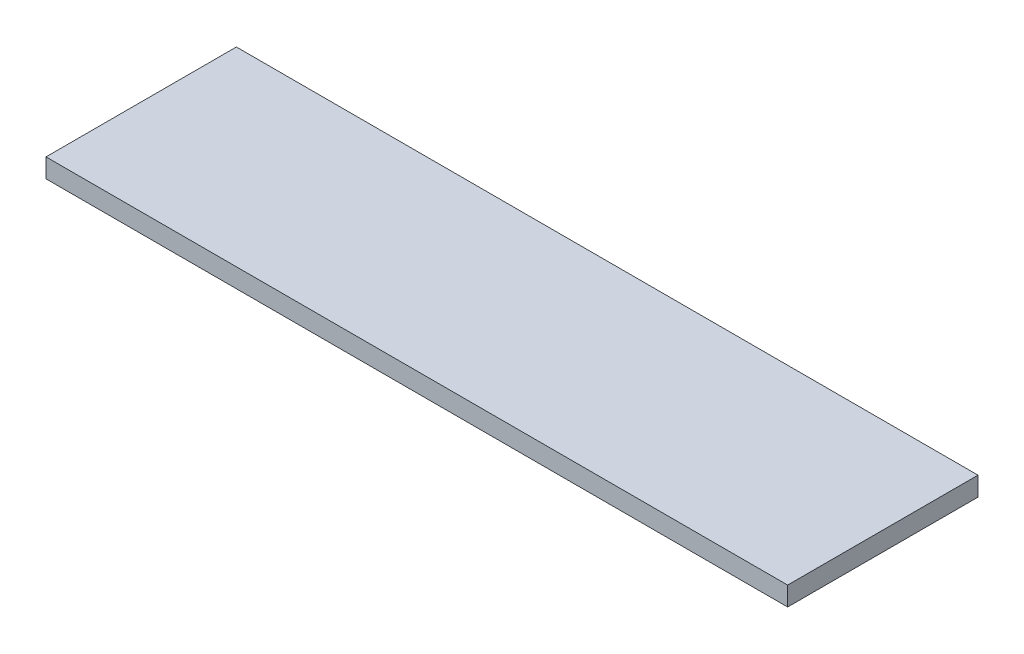
ISO-10303-21;
HEADER;
FILE_DESCRIPTION(('STEP AP214'),'2;1');
FILE_NAME('part.step','',(''),(''),'','','');
FILE_SCHEMA(('AUTOMOTIVE_DESIGN { 1 0 10303 214 1 1 1 1 }'));
ENDSEC;
DATA;
#1=APPLICATION_CONTEXT('core data for automotive mechanical design processes');
#2=APPLICATION_PROTOCOL_DEFINITION('international standard','automotive_design',2000,#1);
#3=PRODUCT_CONTEXT('',#1,'mechanical');
#4=PRODUCT('Part','Part','',(#3));
#5=PRODUCT_RELATED_PRODUCT_CATEGORY('part','',(#4));
#6=PRODUCT_DEFINITION_FORMATION('','',#4);
#7=PRODUCT_DEFINITION_CONTEXT('part definition',#1,'design');
#8=PRODUCT_DEFINITION('design','',#6,#7);
#9=PRODUCT_DEFINITION_SHAPE('','',#8);
#10=(LENGTH_UNIT() NAMED_UNIT(*) SI_UNIT(.MILLI.,.METRE.));
#11=(NAMED_UNIT(*) PLANE_ANGLE_UNIT() SI_UNIT($,.RADIAN.));
#12=(NAMED_UNIT(*) SI_UNIT($,.STERADIAN.) SOLID_ANGLE_UNIT());
#13=UNCERTAINTY_MEASURE_WITH_UNIT(LENGTH_MEASURE(1.E-05),#10,'distance_accuracy_value','');
#14=(GEOMETRIC_REPRESENTATION_CONTEXT(3) GLOBAL_UNCERTAINTY_ASSIGNED_CONTEXT((#13)) GLOBAL_UNIT_ASSIGNED_CONTEXT((#10,
#11,#12)) REPRESENTATION_CONTEXT('',''));
#15=CARTESIAN_POINT('',(0.,0.,0.));
#16=DIRECTION('',(0.,0.,1.));
#17=DIRECTION('',(1.,0.,0.));
#18=AXIS2_PLACEMENT_3D('',#15,#16,#17);
#19=CARTESIAN_POINT('',(-47.625,1.5875,7.9375));
#20=DIRECTION('',(0.,0.,-1.));
#21=DIRECTION('',(-1.,0.,0.));
#22=AXIS2_PLACEMENT_3D('',#19,#20,#21);
#23=PLANE('',#22);
#24=DIRECTION('',(0.,1.,0.));
#25=VECTOR('',#24,1.);
#26=CARTESIAN_POINT('',(30.9245,-0.000999999999999916,7.9375));
#27=LINE('',#26,#25);
#28=CARTESIAN_POINT('',(30.9245,0.,7.9375));
#29=VERTEX_POINT('',#28);
#30=CARTESIAN_POINT('',(30.9245,1.5875,7.9375));
#31=VERTEX_POINT('',#30);
#32=EDGE_CURVE('E55',#29,#31,#27,.T.);
#33=ORIENTED_EDGE('',*,*,#32,.T.);
#34=DIRECTION('',(1.,0.,0.));
#35=VECTOR('',#34,1.);
#36=CARTESIAN_POINT('',(-47.625,1.5875,7.9375));
#37=LINE('',#36,#35);
#38=CARTESIAN_POINT('',(-30.9245,1.5875,7.9375));
#39=VERTEX_POINT('',#38);
#40=EDGE_CURVE('E47',#39,#31,#37,.T.);
#41=ORIENTED_EDGE('',*,*,#40,.F.);
#42=DIRECTION('',(0.,1.,0.));
#43=VECTOR('',#42,1.);
#44=CARTESIAN_POINT('',(-30.9245,-0.000999999999999916,7.9375));
#45=LINE('',#44,#43);
#46=CARTESIAN_POINT('',(-30.9245,0.,7.9375));
#47=VERTEX_POINT('',#46);
#48=EDGE_CURVE('E89',#47,#39,#45,.T.);
#49=ORIENTED_EDGE('',*,*,#48,.F.);
#50=DIRECTION('',(1.,0.,0.));
#51=VECTOR('',#50,1.);
#52=CARTESIAN_POINT('',(-47.625,0.,7.9375));
#53=LINE('',#52,#51);
#54=EDGE_CURVE('E96',#47,#29,#53,.T.);
#55=ORIENTED_EDGE('',*,*,#54,.T.);
#56=EDGE_LOOP('',(#33,#41,#49,#55));
#57=FACE_BOUND('',#56,.T.);
#58=ADVANCED_FACE('F38',(#57),#23,.F.);
#59=CARTESIAN_POINT('',(-47.625,1.5875,-7.9375));
#60=DIRECTION('',(0.,0.,1.));
#61=DIRECTION('',(1.,0.,0.));
#62=AXIS2_PLACEMENT_3D('',#59,#60,#61);
#63=PLANE('',#62);
#64=DIRECTION('',(0.,1.,0.));
#65=VECTOR('',#64,1.);
#66=CARTESIAN_POINT('',(30.9245,-0.000999999999999916,-7.9375));
#67=LINE('',#66,#65);
#68=CARTESIAN_POINT('',(30.9245,0.,-7.9375));
#69=VERTEX_POINT('',#68);
#70=CARTESIAN_POINT('',(30.9245,1.5875,-7.9375));
#71=VERTEX_POINT('',#70);
#72=EDGE_CURVE('E81',#69,#71,#67,.T.);
#73=ORIENTED_EDGE('',*,*,#72,.F.);
#74=DIRECTION('',(-1.,0.,0.));
#75=VECTOR('',#74,1.);
#76=CARTESIAN_POINT('',(-47.625,0.,-7.9375));
#77=LINE('',#76,#75);
#78=CARTESIAN_POINT('',(-30.9245,0.,-7.9375));
#79=VERTEX_POINT('',#78);
#80=EDGE_CURVE('E41',#69,#79,#77,.T.);
#81=ORIENTED_EDGE('',*,*,#80,.T.);
#82=DIRECTION('',(0.,1.,0.));
#83=VECTOR('',#82,1.);
#84=CARTESIAN_POINT('',(-30.9245,-0.000999999999999916,-7.9375));
#85=LINE('',#84,#83);
#86=CARTESIAN_POINT('',(-30.9245,1.5875,-7.9375));
#87=VERTEX_POINT('',#86);
#88=EDGE_CURVE('E63',#79,#87,#85,.T.);
#89=ORIENTED_EDGE('',*,*,#88,.T.);
#90=DIRECTION('',(-1.,0.,0.));
#91=VECTOR('',#90,1.);
#92=CARTESIAN_POINT('',(-47.625,1.5875,-7.9375));
#93=LINE('',#92,#91);
#94=EDGE_CURVE('E11',#71,#87,#93,.T.);
#95=ORIENTED_EDGE('',*,*,#94,.F.);
#96=EDGE_LOOP('',(#73,#81,#89,#95));
#97=FACE_BOUND('',#96,.T.);
#98=ADVANCED_FACE('F94',(#97),#63,.F.);
#99=CARTESIAN_POINT('',(-47.625,1.5875,0.));
#100=DIRECTION('',(0.,1.,0.));
#101=DIRECTION('',(0.,0.,1.));
#102=AXIS2_PLACEMENT_3D('',#99,#100,#101);
#103=PLANE('',#102);
#104=ORIENTED_EDGE('',*,*,#40,.T.);
#105=DIRECTION('',(0.,0.,-1.));
#106=VECTOR('',#105,1.);
#107=CARTESIAN_POINT('',(30.9245,1.5875,-7.9375));
#108=LINE('',#107,#106);
#109=EDGE_CURVE('E88',#31,#71,#108,.T.);
#110=ORIENTED_EDGE('',*,*,#109,.T.);
#111=ORIENTED_EDGE('',*,*,#94,.T.);
#112=DIRECTION('',(0.,0.,1.));
#113=VECTOR('',#112,1.);
#114=CARTESIAN_POINT('',(-30.9245,1.5875,-7.9375));
#115=LINE('',#114,#113);
#116=EDGE_CURVE('E112',#87,#39,#115,.T.);
#117=ORIENTED_EDGE('',*,*,#116,.T.);
#118=EDGE_LOOP('',(#104,#110,#111,#117));
#119=FACE_BOUND('',#118,.T.);
#120=ADVANCED_FACE('F122',(#119),#103,.T.);
#121=CARTESIAN_POINT('',(-47.625,0.,0.));
#122=DIRECTION('',(0.,1.,0.));
#123=DIRECTION('',(0.,0.,1.));
#124=AXIS2_PLACEMENT_3D('',#121,#122,#123);
#125=PLANE('',#124);
#126=DIRECTION('',(0.,0.,1.));
#127=VECTOR('',#126,1.);
#128=CARTESIAN_POINT('',(30.9245,0.,-7.9375));
#129=LINE('',#128,#127);
#130=EDGE_CURVE('E78',#69,#29,#129,.T.);
#131=ORIENTED_EDGE('',*,*,#130,.T.);
#132=ORIENTED_EDGE('',*,*,#54,.F.);
#133=DIRECTION('',(0.,0.,-1.));
#134=VECTOR('',#133,1.);
#135=CARTESIAN_POINT('',(-30.9245,0.,-7.9375));
#136=LINE('',#135,#134);
#137=EDGE_CURVE('E99',#47,#79,#136,.T.);
#138=ORIENTED_EDGE('',*,*,#137,.T.);
#139=ORIENTED_EDGE('',*,*,#80,.F.);
#140=EDGE_LOOP('',(#131,#132,#138,#139));
#141=FACE_BOUND('',#140,.T.);
#142=ADVANCED_FACE('F98',(#141),#125,.F.);
#143=CARTESIAN_POINT('',(-30.9245,-0.000999999999999916,-7.9375));
#144=DIRECTION('',(-1.,0.,0.));
#145=DIRECTION('',(0.,0.,1.));
#146=AXIS2_PLACEMENT_3D('',#143,#144,#145);
#147=PLANE('',#146);
#148=ORIENTED_EDGE('',*,*,#48,.T.);
#149=ORIENTED_EDGE('',*,*,#116,.F.);
#150=ORIENTED_EDGE('',*,*,#88,.F.);
#151=ORIENTED_EDGE('',*,*,#137,.F.);
#152=EDGE_LOOP('',(#148,#149,#150,#151));
#153=FACE_BOUND('',#152,.T.);
#154=ADVANCED_FACE('F124',(#153),#147,.T.);
#155=CARTESIAN_POINT('',(30.9245,-0.000999999999999916,-7.9375));
#156=DIRECTION('',(1.,0.,0.));
#157=DIRECTION('',(0.,0.,-1.));
#158=AXIS2_PLACEMENT_3D('',#155,#156,#157);
#159=PLANE('',#158);
#160=ORIENTED_EDGE('',*,*,#72,.T.);
#161=ORIENTED_EDGE('',*,*,#109,.F.);
#162=ORIENTED_EDGE('',*,*,#32,.F.);
#163=ORIENTED_EDGE('',*,*,#130,.F.);
#164=EDGE_LOOP('',(#160,#161,#162,#163));
#165=FACE_BOUND('',#164,.T.);
#166=ADVANCED_FACE('F80',(#165),#159,.T.);
#167=CLOSED_SHELL('',(#58,#98,#120,#142,#154,#166));
#168=MANIFOLD_SOLID_BREP('B2',#167);
#169=ADVANCED_BREP_SHAPE_REPRESENTATION('',(#18,#168),#14);
#170=SHAPE_DEFINITION_REPRESENTATION(#9,#169);
ENDSEC;
END-ISO-10303-21;
